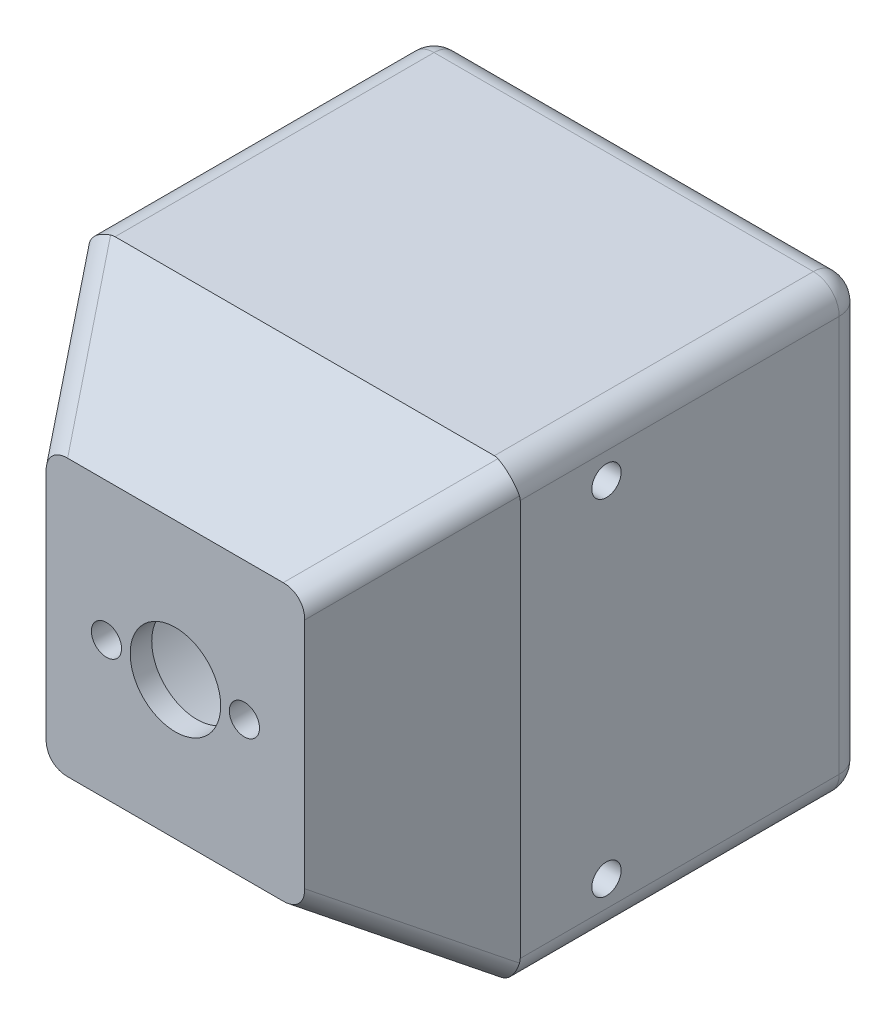
ISO-10303-21;
HEADER;
FILE_DESCRIPTION(('STEP AP214'),'2;1');
FILE_NAME('part.step','',(''),(''),'','','');
FILE_SCHEMA(('AUTOMOTIVE_DESIGN { 1 0 10303 214 1 1 1 1 }'));
ENDSEC;
DATA;
#1=APPLICATION_CONTEXT('core data for automotive mechanical design processes');
#2=APPLICATION_PROTOCOL_DEFINITION('international standard','automotive_design',2000,#1);
#3=PRODUCT_CONTEXT('',#1,'mechanical');
#4=PRODUCT('Part','Part','',(#3));
#5=PRODUCT_RELATED_PRODUCT_CATEGORY('part','',(#4));
#6=PRODUCT_DEFINITION_FORMATION('','',#4);
#7=PRODUCT_DEFINITION_CONTEXT('part definition',#1,'design');
#8=PRODUCT_DEFINITION('design','',#6,#7);
#9=PRODUCT_DEFINITION_SHAPE('','',#8);
#10=(LENGTH_UNIT() NAMED_UNIT(*) SI_UNIT(.MILLI.,.METRE.));
#11=(NAMED_UNIT(*) PLANE_ANGLE_UNIT() SI_UNIT($,.RADIAN.));
#12=(NAMED_UNIT(*) SI_UNIT($,.STERADIAN.) SOLID_ANGLE_UNIT());
#13=UNCERTAINTY_MEASURE_WITH_UNIT(LENGTH_MEASURE(1.E-05),#10,'distance_accuracy_value','');
#14=(GEOMETRIC_REPRESENTATION_CONTEXT(3) GLOBAL_UNCERTAINTY_ASSIGNED_CONTEXT((#13)) GLOBAL_UNIT_ASSIGNED_CONTEXT((#10,
#11,#12)) REPRESENTATION_CONTEXT('',''));
#15=CARTESIAN_POINT('',(0.,0.,0.));
#16=DIRECTION('',(0.,0.,1.));
#17=DIRECTION('',(1.,0.,0.));
#18=AXIS2_PLACEMENT_3D('',#15,#16,#17);
#19=CARTESIAN_POINT('',(25.,26.,82.5));
#20=DIRECTION('',(-1.,0.,0.));
#21=DIRECTION('',(0.,-1.,0.));
#22=AXIS2_PLACEMENT_3D('',#19,#20,#21);
#23=PLANE('',#22);
#24=CARTESIAN_POINT('',(25.,20.,57.5));
#25=DIRECTION('',(1.,0.,0.));
#26=DIRECTION('',(0.,1.,0.));
#27=AXIS2_PLACEMENT_3D('',#24,#25,#26);
#28=CIRCLE('',#27,1.7);
#29=CARTESIAN_POINT('',(25.,21.7,57.5));
#30=VERTEX_POINT('',#29);
#31=EDGE_CURVE('E729',#30,#30,#28,.T.);
#32=ORIENTED_EDGE('',*,*,#31,.F.);
#33=EDGE_LOOP('',(#32));
#34=FACE_BOUND('',#33,.T.);
#35=CARTESIAN_POINT('',(25.,-20.,57.5));
#36=DIRECTION('',(1.,0.,0.));
#37=DIRECTION('',(0.,-1.,0.));
#38=AXIS2_PLACEMENT_3D('',#35,#36,#37);
#39=CIRCLE('',#38,1.7);
#40=CARTESIAN_POINT('',(25.,-21.7,57.5));
#41=VERTEX_POINT('',#40);
#42=EDGE_CURVE('E732',#41,#41,#39,.T.);
#43=ORIENTED_EDGE('',*,*,#42,.F.);
#44=EDGE_LOOP('',(#43));
#45=FACE_BOUND('',#44,.T.);
#46=DIRECTION('',(0.,-1.,0.));
#47=VECTOR('',#46,1.);
#48=CARTESIAN_POINT('',(25.,26.,67.5));
#49=LINE('',#48,#47);
#50=CARTESIAN_POINT('',(25.,23.,67.5));
#51=VERTEX_POINT('',#50);
#52=CARTESIAN_POINT('',(25.,-23.,67.5));
#53=VERTEX_POINT('',#52);
#54=EDGE_CURVE('E724',#51,#53,#49,.T.);
#55=ORIENTED_EDGE('',*,*,#54,.T.);
#56=DIRECTION('',(0.,0.,-1.));
#57=VECTOR('',#56,1.);
#58=CARTESIAN_POINT('',(25.,-23.,82.5));
#59=LINE('',#58,#57);
#60=CARTESIAN_POINT('',(25.,-23.,30.5));
#61=VERTEX_POINT('',#60);
#62=EDGE_CURVE('E626',#53,#61,#59,.T.);
#63=ORIENTED_EDGE('',*,*,#62,.T.);
#64=DIRECTION('',(0.,-1.,0.));
#65=VECTOR('',#64,1.);
#66=CARTESIAN_POINT('',(25.,26.,30.5));
#67=LINE('',#66,#65);
#68=CARTESIAN_POINT('',(25.,23.,30.5));
#69=VERTEX_POINT('',#68);
#70=EDGE_CURVE('E624',#61,#69,#67,.F.);
#71=ORIENTED_EDGE('',*,*,#70,.T.);
#72=DIRECTION('',(0.,0.,-1.));
#73=VECTOR('',#72,1.);
#74=CARTESIAN_POINT('',(25.,23.,82.5));
#75=LINE('',#74,#73);
#76=EDGE_CURVE('E622',#69,#51,#75,.F.);
#77=ORIENTED_EDGE('',*,*,#76,.T.);
#78=EDGE_LOOP('',(#55,#63,#71,#77));
#79=FACE_BOUND('',#78,.T.);
#80=ADVANCED_FACE('F436',(#34,#45,#79),#23,.F.);
#81=CARTESIAN_POINT('',(-25.,26.,82.5));
#82=DIRECTION('',(0.,-1.,0.));
#83=DIRECTION('',(0.,0.,-1.));
#84=AXIS2_PLACEMENT_3D('',#81,#82,#83);
#85=PLANE('',#84);
#86=DIRECTION('',(1.,0.,0.));
#87=VECTOR('',#86,1.);
#88=CARTESIAN_POINT('',(-25.,26.,30.5));
#89=LINE('',#88,#87);
#90=CARTESIAN_POINT('',(22.,26.,30.5));
#91=VERTEX_POINT('',#90);
#92=CARTESIAN_POINT('',(-22.,26.,30.5));
#93=VERTEX_POINT('',#92);
#94=EDGE_CURVE('E569',#91,#93,#89,.F.);
#95=ORIENTED_EDGE('',*,*,#94,.T.);
#96=DIRECTION('',(0.,0.,-1.));
#97=VECTOR('',#96,1.);
#98=CARTESIAN_POINT('',(-22.,26.,82.5));
#99=LINE('',#98,#97);
#100=CARTESIAN_POINT('',(-22.,26.,67.5));
#101=VERTEX_POINT('',#100);
#102=EDGE_CURVE('E608',#93,#101,#99,.F.);
#103=ORIENTED_EDGE('',*,*,#102,.T.);
#104=DIRECTION('',(1.,0.,0.));
#105=VECTOR('',#104,1.);
#106=CARTESIAN_POINT('',(-25.,26.,67.5));
#107=LINE('',#106,#105);
#108=CARTESIAN_POINT('',(22.,26.,67.5));
#109=VERTEX_POINT('',#108);
#110=EDGE_CURVE('E712',#101,#109,#107,.T.);
#111=ORIENTED_EDGE('',*,*,#110,.T.);
#112=DIRECTION('',(0.,0.,-1.));
#113=VECTOR('',#112,1.);
#114=CARTESIAN_POINT('',(22.,26.,82.5));
#115=LINE('',#114,#113);
#116=EDGE_CURVE('E601',#109,#91,#115,.T.);
#117=ORIENTED_EDGE('',*,*,#116,.T.);
#118=EDGE_LOOP('',(#95,#103,#111,#117));
#119=FACE_BOUND('',#118,.T.);
#120=ADVANCED_FACE('F781',(#119),#85,.F.);
#121=CARTESIAN_POINT('',(-25.,26.,82.5));
#122=DIRECTION('',(1.,0.,0.));
#123=DIRECTION('',(0.,1.,0.));
#124=AXIS2_PLACEMENT_3D('',#121,#122,#123);
#125=PLANE('',#124);
#126=CARTESIAN_POINT('',(-25.,20.,57.5));
#127=DIRECTION('',(1.,0.,0.));
#128=DIRECTION('',(0.,1.,0.));
#129=AXIS2_PLACEMENT_3D('',#126,#127,#128);
#130=CIRCLE('',#129,1.7);
#131=CARTESIAN_POINT('',(-25.,21.7,57.5));
#132=VERTEX_POINT('',#131);
#133=EDGE_CURVE('E725',#132,#132,#130,.T.);
#134=ORIENTED_EDGE('',*,*,#133,.T.);
#135=EDGE_LOOP('',(#134));
#136=FACE_BOUND('',#135,.T.);
#137=CARTESIAN_POINT('',(-25.,-20.,57.5));
#138=DIRECTION('',(1.,0.,0.));
#139=DIRECTION('',(0.,-1.,0.));
#140=AXIS2_PLACEMENT_3D('',#137,#138,#139);
#141=CIRCLE('',#140,1.7);
#142=CARTESIAN_POINT('',(-25.,-21.7,57.5));
#143=VERTEX_POINT('',#142);
#144=EDGE_CURVE('E715',#143,#143,#141,.T.);
#145=ORIENTED_EDGE('',*,*,#144,.T.);
#146=EDGE_LOOP('',(#145));
#147=FACE_BOUND('',#146,.T.);
#148=DIRECTION('',(0.,-1.,0.));
#149=VECTOR('',#148,1.);
#150=CARTESIAN_POINT('',(-25.,26.,30.5));
#151=LINE('',#150,#149);
#152=CARTESIAN_POINT('',(-25.,23.,30.5));
#153=VERTEX_POINT('',#152);
#154=CARTESIAN_POINT('',(-25.,-23.,30.5));
#155=VERTEX_POINT('',#154);
#156=EDGE_CURVE('E612',#153,#155,#151,.T.);
#157=ORIENTED_EDGE('',*,*,#156,.T.);
#158=DIRECTION('',(0.,0.,-1.));
#159=VECTOR('',#158,1.);
#160=CARTESIAN_POINT('',(-25.,-23.,82.5));
#161=LINE('',#160,#159);
#162=CARTESIAN_POINT('',(-25.,-23.,67.5));
#163=VERTEX_POINT('',#162);
#164=EDGE_CURVE('E614',#155,#163,#161,.F.);
#165=ORIENTED_EDGE('',*,*,#164,.T.);
#166=DIRECTION('',(0.,-1.,0.));
#167=VECTOR('',#166,1.);
#168=CARTESIAN_POINT('',(-25.,26.,67.5));
#169=LINE('',#168,#167);
#170=CARTESIAN_POINT('',(-25.,23.,67.5));
#171=VERTEX_POINT('',#170);
#172=EDGE_CURVE('E698',#171,#163,#169,.T.);
#173=ORIENTED_EDGE('',*,*,#172,.F.);
#174=DIRECTION('',(0.,0.,-1.));
#175=VECTOR('',#174,1.);
#176=CARTESIAN_POINT('',(-25.,23.,82.5));
#177=LINE('',#176,#175);
#178=EDGE_CURVE('E610',#171,#153,#177,.T.);
#179=ORIENTED_EDGE('',*,*,#178,.T.);
#180=EDGE_LOOP('',(#157,#165,#173,#179));
#181=FACE_BOUND('',#180,.T.);
#182=ADVANCED_FACE('F827',(#136,#147,#181),#125,.F.);
#183=CARTESIAN_POINT('',(-25.,-26.,82.5));
#184=DIRECTION('',(0.,1.,0.));
#185=DIRECTION('',(0.,0.,1.));
#186=AXIS2_PLACEMENT_3D('',#183,#184,#185);
#187=PLANE('',#186);
#188=DIRECTION('',(1.,0.,0.));
#189=VECTOR('',#188,1.);
#190=CARTESIAN_POINT('',(-25.,-26.,30.5));
#191=LINE('',#190,#189);
#192=CARTESIAN_POINT('',(-22.,-26.,30.5));
#193=VERTEX_POINT('',#192);
#194=CARTESIAN_POINT('',(22.,-26.,30.5));
#195=VERTEX_POINT('',#194);
#196=EDGE_CURVE('E618',#193,#195,#191,.T.);
#197=ORIENTED_EDGE('',*,*,#196,.T.);
#198=DIRECTION('',(0.,0.,-1.));
#199=VECTOR('',#198,1.);
#200=CARTESIAN_POINT('',(22.,-26.,82.5));
#201=LINE('',#200,#199);
#202=CARTESIAN_POINT('',(22.,-26.,67.5));
#203=VERTEX_POINT('',#202);
#204=EDGE_CURVE('E620',#195,#203,#201,.F.);
#205=ORIENTED_EDGE('',*,*,#204,.T.);
#206=DIRECTION('',(1.,0.,0.));
#207=VECTOR('',#206,1.);
#208=CARTESIAN_POINT('',(-25.,-26.,67.5));
#209=LINE('',#208,#207);
#210=CARTESIAN_POINT('',(-22.,-26.,67.5));
#211=VERTEX_POINT('',#210);
#212=EDGE_CURVE('E719',#211,#203,#209,.T.);
#213=ORIENTED_EDGE('',*,*,#212,.F.);
#214=DIRECTION('',(0.,0.,-1.));
#215=VECTOR('',#214,1.);
#216=CARTESIAN_POINT('',(-22.,-26.,82.5));
#217=LINE('',#216,#215);
#218=EDGE_CURVE('E616',#211,#193,#217,.T.);
#219=ORIENTED_EDGE('',*,*,#218,.T.);
#220=EDGE_LOOP('',(#197,#205,#213,#219));
#221=FACE_BOUND('',#220,.T.);
#222=ADVANCED_FACE('F1063',(#221),#187,.F.);
#223=CARTESIAN_POINT('',(0.,0.,82.5));
#224=DIRECTION('',(0.,0.,1.));
#225=DIRECTION('',(1.,0.,0.));
#226=AXIS2_PLACEMENT_3D('',#223,#224,#225);
#227=PLANE('',#226);
#228=DIRECTION('',(0.,-1.,0.));
#229=VECTOR('',#228,1.);
#230=CARTESIAN_POINT('',(15.,26.,82.5));
#231=LINE('',#230,#229);
#232=CARTESIAN_POINT('',(15.,13.5038491169865,82.5));
#233=VERTEX_POINT('',#232);
#234=CARTESIAN_POINT('',(15.,-13.5038491169865,82.5));
#235=VERTEX_POINT('',#234);
#236=EDGE_CURVE('E708',#233,#235,#231,.T.);
#237=ORIENTED_EDGE('',*,*,#236,.F.);
#238=CARTESIAN_POINT('',(11.394448724536,12.394448724536,82.5));
#239=DIRECTION('',(0.,0.,1.));
#240=DIRECTION('',(0.707106781186547,0.707106781186548,0.));
#241=AXIS2_PLACEMENT_3D('',#238,#239,#240);
#242=ELLIPSE('',#241,4.12310562561766,3.);
#243=CARTESIAN_POINT('',(12.5038491169865,16.,82.5));
#244=VERTEX_POINT('',#243);
#245=EDGE_CURVE('E650',#233,#244,#242,.T.);
#246=ORIENTED_EDGE('',*,*,#245,.T.);
#247=DIRECTION('',(1.,0.,0.));
#248=VECTOR('',#247,1.);
#249=CARTESIAN_POINT('',(-25.,16.,82.5));
#250=LINE('',#249,#248);
#251=CARTESIAN_POINT('',(-12.5038491169865,16.,82.5));
#252=VERTEX_POINT('',#251);
#253=EDGE_CURVE('E716',#252,#244,#250,.T.);
#254=ORIENTED_EDGE('',*,*,#253,.F.);
#255=CARTESIAN_POINT('',(-11.394448724536,12.394448724536,82.5));
#256=DIRECTION('',(0.,0.,1.));
#257=DIRECTION('',(0.707106781186548,-0.707106781186548,0.));
#258=AXIS2_PLACEMENT_3D('',#255,#256,#257);
#259=ELLIPSE('',#258,4.12310562561766,3.);
#260=CARTESIAN_POINT('',(-15.,13.5038491169865,82.5));
#261=VERTEX_POINT('',#260);
#262=EDGE_CURVE('E648',#252,#261,#259,.T.);
#263=ORIENTED_EDGE('',*,*,#262,.T.);
#264=DIRECTION('',(0.,-1.,0.));
#265=VECTOR('',#264,1.);
#266=CARTESIAN_POINT('',(-15.,26.,82.5));
#267=LINE('',#266,#265);
#268=CARTESIAN_POINT('',(-15.,-13.5038491169865,82.5));
#269=VERTEX_POINT('',#268);
#270=EDGE_CURVE('E703',#261,#269,#267,.T.);
#271=ORIENTED_EDGE('',*,*,#270,.T.);
#272=CARTESIAN_POINT('',(-11.394448724536,-12.394448724536,82.5));
#273=DIRECTION('',(0.,0.,1.));
#274=DIRECTION('',(-0.707106781186547,-0.707106781186548,0.));
#275=AXIS2_PLACEMENT_3D('',#272,#273,#274);
#276=ELLIPSE('',#275,4.12310562561766,3.);
#277=CARTESIAN_POINT('',(-12.5038491169865,-16.,82.5));
#278=VERTEX_POINT('',#277);
#279=EDGE_CURVE('E646',#269,#278,#276,.T.);
#280=ORIENTED_EDGE('',*,*,#279,.T.);
#281=DIRECTION('',(1.,0.,0.));
#282=VECTOR('',#281,1.);
#283=CARTESIAN_POINT('',(-25.,-16.,82.5));
#284=LINE('',#283,#282);
#285=CARTESIAN_POINT('',(12.5038491169865,-16.,82.5));
#286=VERTEX_POINT('',#285);
#287=EDGE_CURVE('E721',#278,#286,#284,.T.);
#288=ORIENTED_EDGE('',*,*,#287,.T.);
#289=CARTESIAN_POINT('',(11.394448724536,-12.394448724536,82.5));
#290=DIRECTION('',(0.,0.,1.));
#291=DIRECTION('',(-0.707106781186548,0.707106781186548,0.));
#292=AXIS2_PLACEMENT_3D('',#289,#290,#291);
#293=ELLIPSE('',#292,4.12310562561766,3.);
#294=EDGE_CURVE('E644',#286,#235,#293,.T.);
#295=ORIENTED_EDGE('',*,*,#294,.T.);
#296=EDGE_LOOP('',(#237,#246,#254,#263,#271,#280,#288,#295));
#297=FACE_BOUND('',#296,.T.);
#298=CARTESIAN_POINT('',(8.,0.,82.5));
#299=DIRECTION('',(0.,0.,1.));
#300=DIRECTION('',(-1.,0.,0.));
#301=AXIS2_PLACEMENT_3D('',#298,#299,#300);
#302=CIRCLE('',#301,1.75);
#303=CARTESIAN_POINT('',(6.25,0.,82.5));
#304=VERTEX_POINT('',#303);
#305=EDGE_CURVE('E728',#304,#304,#302,.T.);
#306=ORIENTED_EDGE('',*,*,#305,.F.);
#307=EDGE_LOOP('',(#306));
#308=FACE_BOUND('',#307,.T.);
#309=CARTESIAN_POINT('',(-8.,0.,82.5));
#310=DIRECTION('',(0.,0.,1.));
#311=DIRECTION('',(1.,0.,0.));
#312=AXIS2_PLACEMENT_3D('',#309,#310,#311);
#313=CIRCLE('',#312,1.75);
#314=CARTESIAN_POINT('',(-6.25,0.,82.5));
#315=VERTEX_POINT('',#314);
#316=EDGE_CURVE('E737',#315,#315,#313,.T.);
#317=ORIENTED_EDGE('',*,*,#316,.F.);
#318=EDGE_LOOP('',(#317));
#319=FACE_BOUND('',#318,.T.);
#320=CARTESIAN_POINT('',(0.,0.,82.5));
#321=DIRECTION('',(0.,0.,1.));
#322=DIRECTION('',(1.,0.,0.));
#323=AXIS2_PLACEMENT_3D('',#320,#321,#322);
#324=CIRCLE('',#323,5.25);
#325=CARTESIAN_POINT('',(5.25,0.,82.5));
#326=VERTEX_POINT('',#325);
#327=EDGE_CURVE('E740',#326,#326,#324,.T.);
#328=ORIENTED_EDGE('',*,*,#327,.F.);
#329=EDGE_LOOP('',(#328));
#330=FACE_BOUND('',#329,.T.);
#331=ADVANCED_FACE('F1054',(#297,#308,#319,#330),#227,.T.);
#332=CARTESIAN_POINT('',(0.,0.,80.));
#333=DIRECTION('',(0.,0.,-1.));
#334=DIRECTION('',(-1.,0.,0.));
#335=AXIS2_PLACEMENT_3D('',#332,#333,#334);
#336=CYLINDRICAL_SURFACE('',#335,15.);
#337=CARTESIAN_POINT('',(0.,0.,30.5));
#338=DIRECTION('',(0.,0.,1.));
#339=DIRECTION('',(0.,-1.,0.));
#340=AXIS2_PLACEMENT_3D('',#337,#338,#339);
#341=CIRCLE('',#340,15.);
#342=CARTESIAN_POINT('',(0.,-15.,30.5));
#343=VERTEX_POINT('',#342);
#344=EDGE_CURVE('E592',#343,#343,#341,.F.);
#345=ORIENTED_EDGE('',*,*,#344,.T.);
#346=EDGE_LOOP('',(#345));
#347=FACE_BOUND('',#346,.T.);
#348=CARTESIAN_POINT('',(0.,0.,80.));
#349=DIRECTION('',(0.,0.,-1.));
#350=DIRECTION('',(-1.,0.,0.));
#351=AXIS2_PLACEMENT_3D('',#348,#349,#350);
#352=CIRCLE('',#351,15.);
#353=CARTESIAN_POINT('',(-15.,0.,80.));
#354=VERTEX_POINT('',#353);
#355=EDGE_CURVE('E746',#354,#354,#352,.T.);
#356=ORIENTED_EDGE('',*,*,#355,.F.);
#357=EDGE_LOOP('',(#356));
#358=FACE_BOUND('',#357,.T.);
#359=ADVANCED_FACE('F1045',(#347,#358),#336,.F.);
#360=CARTESIAN_POINT('',(0.,0.,80.));
#361=DIRECTION('',(0.,0.,-1.));
#362=DIRECTION('',(-1.,0.,0.));
#363=AXIS2_PLACEMENT_3D('',#360,#361,#362);
#364=PLANE('',#363);
#365=CARTESIAN_POINT('',(8.,0.,80.));
#366=DIRECTION('',(0.,0.,-1.));
#367=DIRECTION('',(-1.,0.,0.));
#368=AXIS2_PLACEMENT_3D('',#365,#366,#367);
#369=CIRCLE('',#368,1.75);
#370=CARTESIAN_POINT('',(6.25,0.,80.));
#371=VERTEX_POINT('',#370);
#372=EDGE_CURVE('E749',#371,#371,#369,.T.);
#373=ORIENTED_EDGE('',*,*,#372,.F.);
#374=EDGE_LOOP('',(#373));
#375=FACE_BOUND('',#374,.T.);
#376=CARTESIAN_POINT('',(-8.,0.,80.));
#377=DIRECTION('',(0.,0.,-1.));
#378=DIRECTION('',(-1.,0.,0.));
#379=AXIS2_PLACEMENT_3D('',#376,#377,#378);
#380=CIRCLE('',#379,1.75);
#381=CARTESIAN_POINT('',(-9.75,0.,80.));
#382=VERTEX_POINT('',#381);
#383=EDGE_CURVE('E752',#382,#382,#380,.T.);
#384=ORIENTED_EDGE('',*,*,#383,.F.);
#385=EDGE_LOOP('',(#384));
#386=FACE_BOUND('',#385,.T.);
#387=CARTESIAN_POINT('',(0.,0.,80.));
#388=DIRECTION('',(0.,0.,-1.));
#389=DIRECTION('',(-1.,0.,0.));
#390=AXIS2_PLACEMENT_3D('',#387,#388,#389);
#391=CIRCLE('',#390,5.25);
#392=CARTESIAN_POINT('',(-5.25,0.,80.));
#393=VERTEX_POINT('',#392);
#394=EDGE_CURVE('E745',#393,#393,#391,.T.);
#395=ORIENTED_EDGE('',*,*,#394,.F.);
#396=EDGE_LOOP('',(#395));
#397=FACE_BOUND('',#396,.T.);
#398=ORIENTED_EDGE('',*,*,#355,.T.);
#399=EDGE_LOOP('',(#398));
#400=FACE_BOUND('',#399,.T.);
#401=ADVANCED_FACE('F1036',(#375,#386,#397,#400),#364,.T.);
#402=CARTESIAN_POINT('',(0.,0.,0.));
#403=DIRECTION('',(0.,0.,1.));
#404=DIRECTION('',(1.,0.,0.));
#405=AXIS2_PLACEMENT_3D('',#402,#403,#404);
#406=CYLINDRICAL_SURFACE('',#405,5.25);
#407=ORIENTED_EDGE('',*,*,#394,.T.);
#408=EDGE_LOOP('',(#407));
#409=FACE_BOUND('',#408,.T.);
#410=ORIENTED_EDGE('',*,*,#327,.T.);
#411=EDGE_LOOP('',(#410));
#412=FACE_BOUND('',#411,.T.);
#413=ADVANCED_FACE('F1027',(#409,#412),#406,.F.);
#414=CARTESIAN_POINT('',(-8.,0.,0.));
#415=DIRECTION('',(0.,0.,1.));
#416=DIRECTION('',(1.,0.,0.));
#417=AXIS2_PLACEMENT_3D('',#414,#415,#416);
#418=CYLINDRICAL_SURFACE('',#417,1.75);
#419=ORIENTED_EDGE('',*,*,#383,.T.);
#420=EDGE_LOOP('',(#419));
#421=FACE_BOUND('',#420,.T.);
#422=ORIENTED_EDGE('',*,*,#316,.T.);
#423=EDGE_LOOP('',(#422));
#424=FACE_BOUND('',#423,.T.);
#425=ADVANCED_FACE('F1018',(#421,#424),#418,.F.);
#426=CARTESIAN_POINT('',(8.,0.,0.));
#427=DIRECTION('',(0.,0.,1.));
#428=DIRECTION('',(1.,0.,0.));
#429=AXIS2_PLACEMENT_3D('',#426,#427,#428);
#430=CYLINDRICAL_SURFACE('',#429,1.75);
#431=ORIENTED_EDGE('',*,*,#372,.T.);
#432=EDGE_LOOP('',(#431));
#433=FACE_BOUND('',#432,.T.);
#434=ORIENTED_EDGE('',*,*,#305,.T.);
#435=EDGE_LOOP('',(#434));
#436=FACE_BOUND('',#435,.T.);
#437=ADVANCED_FACE('F1009',(#433,#436),#430,.F.);
#438=CARTESIAN_POINT('',(-25.,-20.,57.5));
#439=DIRECTION('',(1.,0.,0.));
#440=DIRECTION('',(0.,1.,0.));
#441=AXIS2_PLACEMENT_3D('',#438,#439,#440);
#442=CYLINDRICAL_SURFACE('',#441,1.7);
#443=ORIENTED_EDGE('',*,*,#144,.F.);
#444=EDGE_LOOP('',(#443));
#445=FACE_BOUND('',#444,.T.);
#446=ORIENTED_EDGE('',*,*,#42,.T.);
#447=EDGE_LOOP('',(#446));
#448=FACE_BOUND('',#447,.T.);
#449=ADVANCED_FACE('F1000',(#445,#448),#442,.F.);
#450=CARTESIAN_POINT('',(-25.,20.,57.5));
#451=DIRECTION('',(1.,0.,0.));
#452=DIRECTION('',(0.,1.,0.));
#453=AXIS2_PLACEMENT_3D('',#450,#451,#452);
#454=CYLINDRICAL_SURFACE('',#453,1.7);
#455=ORIENTED_EDGE('',*,*,#133,.F.);
#456=EDGE_LOOP('',(#455));
#457=FACE_BOUND('',#456,.T.);
#458=ORIENTED_EDGE('',*,*,#31,.T.);
#459=EDGE_LOOP('',(#458));
#460=FACE_BOUND('',#459,.T.);
#461=ADVANCED_FACE('F992',(#457,#460),#454,.F.);
#462=CARTESIAN_POINT('',(-25.,-26.,27.5));
#463=DIRECTION('',(0.,0.,1.));
#464=DIRECTION('',(0.,-1.,0.));
#465=AXIS2_PLACEMENT_3D('',#462,#463,#464);
#466=PLANE('',#465);
#467=CARTESIAN_POINT('',(0.,0.,27.5));
#468=DIRECTION('',(0.,0.,1.));
#469=DIRECTION('',(0.,-1.,0.));
#470=AXIS2_PLACEMENT_3D('',#467,#468,#469);
#471=CIRCLE('',#470,18.);
#472=CARTESIAN_POINT('',(0.,-18.,27.5));
#473=VERTEX_POINT('',#472);
#474=EDGE_CURVE('E598',#473,#473,#471,.T.);
#475=ORIENTED_EDGE('',*,*,#474,.T.);
#476=EDGE_LOOP('',(#475));
#477=FACE_BOUND('',#476,.T.);
#478=DIRECTION('',(0.,-1.,0.));
#479=VECTOR('',#478,1.);
#480=CARTESIAN_POINT('',(-22.,-26.,27.5));
#481=LINE('',#480,#479);
#482=CARTESIAN_POINT('',(-22.,-23.,27.5));
#483=VERTEX_POINT('',#482);
#484=CARTESIAN_POINT('',(-22.,23.,27.5));
#485=VERTEX_POINT('',#484);
#486=EDGE_CURVE('E596',#483,#485,#481,.F.);
#487=ORIENTED_EDGE('',*,*,#486,.T.);
#488=DIRECTION('',(1.,0.,0.));
#489=VECTOR('',#488,1.);
#490=CARTESIAN_POINT('',(-25.,23.,27.5));
#491=LINE('',#490,#489);
#492=CARTESIAN_POINT('',(22.,23.,27.5));
#493=VERTEX_POINT('',#492);
#494=EDGE_CURVE('E567',#485,#493,#491,.T.);
#495=ORIENTED_EDGE('',*,*,#494,.T.);
#496=DIRECTION('',(0.,-1.,0.));
#497=VECTOR('',#496,1.);
#498=CARTESIAN_POINT('',(22.,-26.,27.5));
#499=LINE('',#498,#497);
#500=CARTESIAN_POINT('',(22.,-23.,27.5));
#501=VERTEX_POINT('',#500);
#502=EDGE_CURVE('E585',#493,#501,#499,.T.);
#503=ORIENTED_EDGE('',*,*,#502,.T.);
#504=DIRECTION('',(1.,0.,0.));
#505=VECTOR('',#504,1.);
#506=CARTESIAN_POINT('',(-25.,-23.,27.5));
#507=LINE('',#506,#505);
#508=EDGE_CURVE('E591',#501,#483,#507,.F.);
#509=ORIENTED_EDGE('',*,*,#508,.T.);
#510=EDGE_LOOP('',(#487,#495,#503,#509));
#511=FACE_BOUND('',#510,.T.);
#512=ADVANCED_FACE('F594',(#477,#511),#466,.F.);
#513=CARTESIAN_POINT('',(-25.,-16.,82.5));
#514=DIRECTION('',(0.,0.832050294337843,-0.554700196225229));
#515=DIRECTION('',(0.,0.554700196225229,0.832050294337844));
#516=AXIS2_PLACEMENT_3D('',#513,#514,#515);
#517=PLANE('',#516);
#518=CARTESIAN_POINT('',(22.,-23.,72.));
#519=DIRECTION('',(0.,0.832050294337843,-0.554700196225229));
#520=DIRECTION('',(0.,-0.554700196225229,-0.832050294337844));
#521=AXIS2_PLACEMENT_3D('',#518,#519,#520);
#522=ELLIPSE('',#521,5.40832691319598,3.);
#523=CARTESIAN_POINT('',(22.4672401831838,-25.9633910661974,67.554913400704));
#524=VERTEX_POINT('',#523);
#525=EDGE_CURVE('E445',#203,#524,#522,.F.);
#526=ORIENTED_EDGE('',*,*,#525,.T.);
#527=DIRECTION('',(-0.485071250072666,0.485071250072666,0.727606875108999));
#528=VECTOR('',#527,1.);
#529=CARTESIAN_POINT('',(3.67941403063671,-7.17556491365025,95.7366526295246));
#530=LINE('',#529,#528);
#531=EDGE_CURVE('E12',#524,#286,#530,.T.);
#532=ORIENTED_EDGE('',*,*,#531,.T.);
#533=ORIENTED_EDGE('',*,*,#287,.F.);
#534=DIRECTION('',(-0.485071250072666,-0.485071250072666,-0.727606875108999));
#535=VECTOR('',#534,1.);
#536=CARTESIAN_POINT('',(-15.4441199129897,-18.9402707960032,78.0895938059952));
#537=LINE('',#536,#535);
#538=CARTESIAN_POINT('',(-22.4672401831838,-25.9633910661974,67.554913400704));
#539=VERTEX_POINT('',#538);
#540=EDGE_CURVE('E458',#278,#539,#537,.T.);
#541=ORIENTED_EDGE('',*,*,#540,.T.);
#542=CARTESIAN_POINT('',(-22.,-23.,72.));
#543=DIRECTION('',(0.,0.832050294337843,-0.554700196225229));
#544=DIRECTION('',(0.,-0.554700196225229,-0.832050294337844));
#545=AXIS2_PLACEMENT_3D('',#542,#543,#544);
#546=ELLIPSE('',#545,5.40832691319598,3.);
#547=EDGE_CURVE('E660',#539,#211,#546,.F.);
#548=ORIENTED_EDGE('',*,*,#547,.T.);
#549=ORIENTED_EDGE('',*,*,#212,.T.);
#550=EDGE_LOOP('',(#526,#532,#533,#541,#548,#549));
#551=FACE_BOUND('',#550,.T.);
#552=ADVANCED_FACE('F976',(#551),#517,.F.);
#553=CARTESIAN_POINT('',(-25.,16.,82.5));
#554=DIRECTION('',(0.,-0.832050294337843,-0.554700196225229));
#555=DIRECTION('',(0.,0.554700196225229,-0.832050294337844));
#556=AXIS2_PLACEMENT_3D('',#553,#554,#555);
#557=PLANE('',#556);
#558=CARTESIAN_POINT('',(-22.,23.,72.));
#559=DIRECTION('',(0.,-0.832050294337843,-0.554700196225229));
#560=DIRECTION('',(0.,0.554700196225229,-0.832050294337844));
#561=AXIS2_PLACEMENT_3D('',#558,#559,#560);
#562=ELLIPSE('',#561,5.40832691319598,3.);
#563=CARTESIAN_POINT('',(-22.4672401831839,25.9633910661974,67.554913400704));
#564=VERTEX_POINT('',#563);
#565=EDGE_CURVE('E632',#101,#564,#562,.F.);
#566=ORIENTED_EDGE('',*,*,#565,.T.);
#567=DIRECTION('',(0.485071250072666,-0.485071250072666,0.727606875108999));
#568=VECTOR('',#567,1.);
#569=CARTESIAN_POINT('',(-15.4441199129897,18.9402707960032,78.0895938059952));
#570=LINE('',#569,#568);
#571=EDGE_CURVE('E634',#564,#252,#570,.T.);
#572=ORIENTED_EDGE('',*,*,#571,.T.);
#573=ORIENTED_EDGE('',*,*,#253,.T.);
#574=DIRECTION('',(0.485071250072666,0.485071250072666,-0.727606875108999));
#575=VECTOR('',#574,1.);
#576=CARTESIAN_POINT('',(3.67941403063672,7.17556491365022,95.7366526295246));
#577=LINE('',#576,#575);
#578=CARTESIAN_POINT('',(22.4672401831838,25.9633910661974,67.554913400704));
#579=VERTEX_POINT('',#578);
#580=EDGE_CURVE('E630',#244,#579,#577,.T.);
#581=ORIENTED_EDGE('',*,*,#580,.T.);
#582=CARTESIAN_POINT('',(22.,23.,72.));
#583=DIRECTION('',(0.,-0.832050294337843,-0.554700196225229));
#584=DIRECTION('',(0.,0.554700196225229,-0.832050294337844));
#585=AXIS2_PLACEMENT_3D('',#582,#583,#584);
#586=ELLIPSE('',#585,5.40832691319598,3.);
#587=EDGE_CURVE('E628',#579,#109,#586,.F.);
#588=ORIENTED_EDGE('',*,*,#587,.T.);
#589=ORIENTED_EDGE('',*,*,#110,.F.);
#590=EDGE_LOOP('',(#566,#572,#573,#581,#588,#589));
#591=FACE_BOUND('',#590,.T.);
#592=ADVANCED_FACE('F968',(#591),#557,.F.);
#593=CARTESIAN_POINT('',(-15.,26.,82.5));
#594=DIRECTION('',(0.832050294337844,0.,-0.554700196225229));
#595=DIRECTION('',(-0.554700196225229,0.,-0.832050294337844));
#596=AXIS2_PLACEMENT_3D('',#593,#594,#595);
#597=PLANE('',#596);
#598=CARTESIAN_POINT('',(-22.,-23.,72.0000000000001));
#599=DIRECTION('',(0.832050294337844,0.,-0.554700196225229));
#600=DIRECTION('',(-0.554700196225229,0.,-0.832050294337844));
#601=AXIS2_PLACEMENT_3D('',#598,#599,#600);
#602=ELLIPSE('',#601,5.40832691319598,3.);
#603=CARTESIAN_POINT('',(-24.9633910661974,-23.4672401831838,67.554913400704));
#604=VERTEX_POINT('',#603);
#605=EDGE_CURVE('E656',#163,#604,#602,.F.);
#606=ORIENTED_EDGE('',*,*,#605,.T.);
#607=DIRECTION('',(-0.485071250072666,-0.485071250072666,-0.727606875108999));
#608=VECTOR('',#607,1.);
#609=CARTESIAN_POINT('',(-5.70497667835614,-4.2088257953426,96.4425349824658));
#610=LINE('',#609,#608);
#611=EDGE_CURVE('E658',#604,#269,#610,.F.);
#612=ORIENTED_EDGE('',*,*,#611,.T.);
#613=ORIENTED_EDGE('',*,*,#270,.F.);
#614=DIRECTION('',(0.485071250072666,-0.485071250072666,0.727606875108999));
#615=VECTOR('',#614,1.);
#616=CARTESIAN_POINT('',(-17.9402707960032,16.4441199129896,78.0895938059952));
#617=LINE('',#616,#615);
#618=CARTESIAN_POINT('',(-24.9633910661974,23.4672401831838,67.554913400704));
#619=VERTEX_POINT('',#618);
#620=EDGE_CURVE('E654',#261,#619,#617,.F.);
#621=ORIENTED_EDGE('',*,*,#620,.T.);
#622=CARTESIAN_POINT('',(-22.,23.,72.));
#623=DIRECTION('',(0.832050294337844,0.,-0.554700196225229));
#624=DIRECTION('',(-0.554700196225229,0.,-0.832050294337844));
#625=AXIS2_PLACEMENT_3D('',#622,#623,#624);
#626=ELLIPSE('',#625,5.40832691319598,3.);
#627=EDGE_CURVE('E652',#619,#171,#626,.F.);
#628=ORIENTED_EDGE('',*,*,#627,.T.);
#629=ORIENTED_EDGE('',*,*,#172,.T.);
#630=EDGE_LOOP('',(#606,#612,#613,#621,#628,#629));
#631=FACE_BOUND('',#630,.T.);
#632=ADVANCED_FACE('F960',(#631),#597,.F.);
#633=CARTESIAN_POINT('',(15.,26.,82.5));
#634=DIRECTION('',(-0.832050294337844,0.,-0.554700196225229));
#635=DIRECTION('',(-0.554700196225229,0.,0.832050294337844));
#636=AXIS2_PLACEMENT_3D('',#633,#634,#635);
#637=PLANE('',#636);
#638=ORIENTED_EDGE('',*,*,#236,.T.);
#639=DIRECTION('',(-0.485071250072666,0.485071250072666,0.727606875108999));
#640=VECTOR('',#639,1.);
#641=CARTESIAN_POINT('',(5.70497667835613,-4.20882579534261,96.4425349824658));
#642=LINE('',#641,#640);
#643=CARTESIAN_POINT('',(24.9633910661974,-23.4672401831838,67.554913400704));
#644=VERTEX_POINT('',#643);
#645=EDGE_CURVE('E642',#235,#644,#642,.F.);
#646=ORIENTED_EDGE('',*,*,#645,.T.);
#647=CARTESIAN_POINT('',(22.,-23.,72.));
#648=DIRECTION('',(-0.832050294337844,0.,-0.554700196225229));
#649=DIRECTION('',(0.554700196225229,0.,-0.832050294337844));
#650=AXIS2_PLACEMENT_3D('',#647,#648,#649);
#651=ELLIPSE('',#650,5.40832691319598,3.);
#652=EDGE_CURVE('E640',#644,#53,#651,.F.);
#653=ORIENTED_EDGE('',*,*,#652,.T.);
#654=ORIENTED_EDGE('',*,*,#54,.F.);
#655=CARTESIAN_POINT('',(22.,23.,72.));
#656=DIRECTION('',(-0.832050294337844,0.,-0.554700196225229));
#657=DIRECTION('',(0.554700196225229,0.,-0.832050294337844));
#658=AXIS2_PLACEMENT_3D('',#655,#656,#657);
#659=ELLIPSE('',#658,5.40832691319598,3.);
#660=CARTESIAN_POINT('',(24.9633910661974,23.4672401831838,67.554913400704));
#661=VERTEX_POINT('',#660);
#662=EDGE_CURVE('E636',#51,#661,#659,.F.);
#663=ORIENTED_EDGE('',*,*,#662,.T.);
#664=DIRECTION('',(0.485071250072666,0.485071250072666,-0.727606875108999));
#665=VECTOR('',#664,1.);
#666=CARTESIAN_POINT('',(17.9402707960032,16.4441199129896,78.0895938059952));
#667=LINE('',#666,#665);
#668=EDGE_CURVE('E638',#661,#233,#667,.F.);
#669=ORIENTED_EDGE('',*,*,#668,.T.);
#670=EDGE_LOOP('',(#638,#646,#653,#654,#663,#669));
#671=FACE_BOUND('',#670,.T.);
#672=ADVANCED_FACE('F794',(#671),#637,.F.);
#673=CARTESIAN_POINT('',(0.,0.,30.5));
#674=DIRECTION('',(0.,0.,1.));
#675=DIRECTION('',(0.,-1.,0.));
#676=AXIS2_PLACEMENT_3D('',#673,#674,#675);
#677=TOROIDAL_SURFACE('',#676,18.,3.);
#678=ORIENTED_EDGE('',*,*,#474,.F.);
#679=EDGE_LOOP('',(#678));
#680=FACE_BOUND('',#679,.T.);
#681=ORIENTED_EDGE('',*,*,#344,.F.);
#682=EDGE_LOOP('',(#681));
#683=FACE_BOUND('',#682,.T.);
#684=ADVANCED_FACE('F833',(#680,#683),#677,.T.);
#685=CARTESIAN_POINT('',(-15.4441199129897,-16.4441199129897,76.4254932173195));
#686=DIRECTION('',(-0.485071250072666,-0.485071250072666,-0.727606875108999));
#687=DIRECTION('',(0.,0.832050294337844,-0.554700196225229));
#688=AXIS2_PLACEMENT_3D('',#685,#686,#687);
#689=CYLINDRICAL_SURFACE('',#688,3.);
#690=ORIENTED_EDGE('',*,*,#279,.F.);
#691=ORIENTED_EDGE('',*,*,#611,.F.);
#692=CARTESIAN_POINT('',(-22.,-23.,66.5916730868041));
#693=DIRECTION('',(-0.260956473808852,-0.260956473808852,-0.929410263314592));
#694=DIRECTION('',(0.657192299694123,0.657192299694123,-0.369048184449539));
#695=AXIS2_PLACEMENT_3D('',#692,#693,#694);
#696=ELLIPSE('',#695,3.22785331560788,3.);
#697=EDGE_CURVE('E440',#539,#604,#696,.T.);
#698=ORIENTED_EDGE('',*,*,#697,.F.);
#699=ORIENTED_EDGE('',*,*,#540,.F.);
#700=EDGE_LOOP('',(#690,#691,#698,#699));
#701=FACE_BOUND('',#700,.T.);
#702=ADVANCED_FACE('F438',(#701),#689,.T.);
#703=CARTESIAN_POINT('',(3.67941403063671,-4.67941403063672,94.0725520408489));
#704=DIRECTION('',(-0.485071250072666,0.485071250072666,0.727606875108999));
#705=DIRECTION('',(0.832050294337844,0.,0.554700196225229));
#706=AXIS2_PLACEMENT_3D('',#703,#704,#705);
#707=CYLINDRICAL_SURFACE('',#706,3.);
#708=ORIENTED_EDGE('',*,*,#294,.F.);
#709=ORIENTED_EDGE('',*,*,#531,.F.);
#710=CARTESIAN_POINT('',(22.,-23.,66.591673086804));
#711=DIRECTION('',(0.260956473808853,-0.260956473808852,-0.929410263314592));
#712=DIRECTION('',(-0.657192299694123,0.657192299694123,-0.369048184449538));
#713=AXIS2_PLACEMENT_3D('',#710,#711,#712);
#714=ELLIPSE('',#713,3.22785331560788,3.);
#715=EDGE_CURVE('E692',#644,#524,#714,.T.);
#716=ORIENTED_EDGE('',*,*,#715,.F.);
#717=ORIENTED_EDGE('',*,*,#645,.F.);
#718=EDGE_LOOP('',(#708,#709,#716,#717));
#719=FACE_BOUND('',#718,.T.);
#720=ADVANCED_FACE('F803',(#719),#707,.T.);
#721=CARTESIAN_POINT('',(-22.,-23.,82.5));
#722=DIRECTION('',(0.,0.,-1.));
#723=DIRECTION('',(-1.,0.,0.));
#724=AXIS2_PLACEMENT_3D('',#721,#722,#723);
#725=CYLINDRICAL_SURFACE('',#724,3.);
#726=ORIENTED_EDGE('',*,*,#605,.F.);
#727=ORIENTED_EDGE('',*,*,#164,.F.);
#728=CARTESIAN_POINT('',(-22.,-23.,30.5));
#729=DIRECTION('',(0.,0.,-1.));
#730=DIRECTION('',(-1.,0.,0.));
#731=AXIS2_PLACEMENT_3D('',#728,#729,#730);
#732=CIRCLE('',#731,3.);
#733=EDGE_CURVE('E690',#193,#155,#732,.T.);
#734=ORIENTED_EDGE('',*,*,#733,.F.);
#735=ORIENTED_EDGE('',*,*,#218,.F.);
#736=ORIENTED_EDGE('',*,*,#547,.F.);
#737=ORIENTED_EDGE('',*,*,#697,.T.);
#738=EDGE_LOOP('',(#726,#727,#734,#735,#736,#737));
#739=FACE_BOUND('',#738,.T.);
#740=ADVANCED_FACE('F927',(#739),#725,.T.);
#741=CARTESIAN_POINT('',(-25.,-23.,30.5));
#742=DIRECTION('',(1.,0.,0.));
#743=DIRECTION('',(0.,0.,-1.));
#744=AXIS2_PLACEMENT_3D('',#741,#742,#743);
#745=CYLINDRICAL_SURFACE('',#744,3.);
#746=CARTESIAN_POINT('',(22.,-23.,30.5));
#747=DIRECTION('',(1.,0.,0.));
#748=DIRECTION('',(0.,0.,-1.));
#749=AXIS2_PLACEMENT_3D('',#746,#747,#748);
#750=CIRCLE('',#749,3.);
#751=EDGE_CURVE('E684',#195,#501,#750,.T.);
#752=ORIENTED_EDGE('',*,*,#751,.F.);
#753=ORIENTED_EDGE('',*,*,#196,.F.);
#754=CARTESIAN_POINT('',(-22.,-23.,30.5));
#755=DIRECTION('',(-1.,0.,0.));
#756=DIRECTION('',(0.,0.,1.));
#757=AXIS2_PLACEMENT_3D('',#754,#755,#756);
#758=CIRCLE('',#757,3.);
#759=EDGE_CURVE('E687',#483,#193,#758,.T.);
#760=ORIENTED_EDGE('',*,*,#759,.F.);
#761=ORIENTED_EDGE('',*,*,#508,.F.);
#762=EDGE_LOOP('',(#752,#753,#760,#761));
#763=FACE_BOUND('',#762,.T.);
#764=ADVANCED_FACE('F763',(#763),#745,.T.);
#765=CARTESIAN_POINT('',(22.,-23.,82.5));
#766=DIRECTION('',(0.,0.,-1.));
#767=DIRECTION('',(-1.,0.,0.));
#768=AXIS2_PLACEMENT_3D('',#765,#766,#767);
#769=CYLINDRICAL_SURFACE('',#768,3.);
#770=ORIENTED_EDGE('',*,*,#525,.F.);
#771=ORIENTED_EDGE('',*,*,#204,.F.);
#772=CARTESIAN_POINT('',(22.,-23.,30.5));
#773=DIRECTION('',(0.,0.,-1.));
#774=DIRECTION('',(0.,1.,0.));
#775=AXIS2_PLACEMENT_3D('',#772,#773,#774);
#776=CIRCLE('',#775,3.);
#777=EDGE_CURVE('E681',#61,#195,#776,.T.);
#778=ORIENTED_EDGE('',*,*,#777,.F.);
#779=ORIENTED_EDGE('',*,*,#62,.F.);
#780=ORIENTED_EDGE('',*,*,#652,.F.);
#781=ORIENTED_EDGE('',*,*,#715,.T.);
#782=EDGE_LOOP('',(#770,#771,#778,#779,#780,#781));
#783=FACE_BOUND('',#782,.T.);
#784=ADVANCED_FACE('F804',(#783),#769,.T.);
#785=CARTESIAN_POINT('',(-15.4441199129897,16.4441199129896,76.4254932173195));
#786=DIRECTION('',(0.485071250072666,-0.485071250072666,0.727606875108999));
#787=DIRECTION('',(0.832050294337844,0.,-0.554700196225229));
#788=AXIS2_PLACEMENT_3D('',#785,#786,#787);
#789=CYLINDRICAL_SURFACE('',#788,3.);
#790=ORIENTED_EDGE('',*,*,#262,.F.);
#791=ORIENTED_EDGE('',*,*,#571,.F.);
#792=CARTESIAN_POINT('',(-22.,23.,66.591673086804));
#793=DIRECTION('',(-0.260956473808853,0.260956473808852,-0.929410263314592));
#794=DIRECTION('',(0.657192299694123,-0.657192299694123,-0.369048184449538));
#795=AXIS2_PLACEMENT_3D('',#792,#793,#794);
#796=ELLIPSE('',#795,3.22785331560788,3.);
#797=EDGE_CURVE('E678',#619,#564,#796,.T.);
#798=ORIENTED_EDGE('',*,*,#797,.F.);
#799=ORIENTED_EDGE('',*,*,#620,.F.);
#800=EDGE_LOOP('',(#790,#791,#798,#799));
#801=FACE_BOUND('',#800,.T.);
#802=ADVANCED_FACE('F818',(#801),#789,.T.);
#803=CARTESIAN_POINT('',(-22.,-23.,30.5));
#804=DIRECTION('',(0.,-1.,0.));
#805=DIRECTION('',(0.,0.,-1.));
#806=AXIS2_PLACEMENT_3D('',#803,#804,#805);
#807=SPHERICAL_SURFACE('',#806,3.);
#808=ORIENTED_EDGE('',*,*,#759,.T.);
#809=ORIENTED_EDGE('',*,*,#733,.T.);
#810=CARTESIAN_POINT('',(-22.,-23.,30.5));
#811=DIRECTION('',(0.,-1.,0.));
#812=DIRECTION('',(0.,0.,-1.));
#813=AXIS2_PLACEMENT_3D('',#810,#811,#812);
#814=CIRCLE('',#813,3.);
#815=EDGE_CURVE('E675',#483,#155,#814,.F.);
#816=ORIENTED_EDGE('',*,*,#815,.F.);
#817=EDGE_LOOP('',(#808,#809,#816));
#818=FACE_BOUND('',#817,.T.);
#819=ADVANCED_FACE('F766',(#818),#807,.T.);
#820=CARTESIAN_POINT('',(22.,-23.,30.5));
#821=DIRECTION('',(0.,-1.,0.));
#822=DIRECTION('',(0.,0.,-1.));
#823=AXIS2_PLACEMENT_3D('',#820,#821,#822);
#824=SPHERICAL_SURFACE('',#823,3.);
#825=ORIENTED_EDGE('',*,*,#777,.T.);
#826=ORIENTED_EDGE('',*,*,#751,.T.);
#827=CARTESIAN_POINT('',(22.,-23.,30.5));
#828=DIRECTION('',(0.,-1.,0.));
#829=DIRECTION('',(1.,0.,0.));
#830=AXIS2_PLACEMENT_3D('',#827,#828,#829);
#831=CIRCLE('',#830,3.);
#832=EDGE_CURVE('E588',#61,#501,#831,.F.);
#833=ORIENTED_EDGE('',*,*,#832,.F.);
#834=EDGE_LOOP('',(#825,#826,#833));
#835=FACE_BOUND('',#834,.T.);
#836=ADVANCED_FACE('F808',(#835),#824,.T.);
#837=CARTESIAN_POINT('',(3.67941403063671,4.67941403063669,94.072552040849));
#838=DIRECTION('',(0.485071250072666,0.485071250072666,-0.727606875108999));
#839=DIRECTION('',(0.,0.832050294337844,0.554700196225229));
#840=AXIS2_PLACEMENT_3D('',#837,#838,#839);
#841=CYLINDRICAL_SURFACE('',#840,3.);
#842=ORIENTED_EDGE('',*,*,#245,.F.);
#843=ORIENTED_EDGE('',*,*,#668,.F.);
#844=CARTESIAN_POINT('',(22.,23.,66.591673086804));
#845=DIRECTION('',(0.260956473808852,0.260956473808852,-0.929410263314592));
#846=DIRECTION('',(-0.657192299694123,-0.657192299694123,-0.369048184449539));
#847=AXIS2_PLACEMENT_3D('',#844,#845,#846);
#848=ELLIPSE('',#847,3.22785331560788,3.);
#849=EDGE_CURVE('E671',#579,#661,#848,.T.);
#850=ORIENTED_EDGE('',*,*,#849,.F.);
#851=ORIENTED_EDGE('',*,*,#580,.F.);
#852=EDGE_LOOP('',(#842,#843,#850,#851));
#853=FACE_BOUND('',#852,.T.);
#854=ADVANCED_FACE('F810',(#853),#841,.T.);
#855=CARTESIAN_POINT('',(-22.,23.,82.5));
#856=DIRECTION('',(0.,0.,-1.));
#857=DIRECTION('',(-1.,0.,0.));
#858=AXIS2_PLACEMENT_3D('',#855,#856,#857);
#859=CYLINDRICAL_SURFACE('',#858,3.);
#860=ORIENTED_EDGE('',*,*,#565,.F.);
#861=ORIENTED_EDGE('',*,*,#102,.F.);
#862=CARTESIAN_POINT('',(-22.,23.,30.5));
#863=DIRECTION('',(0.,0.,-1.));
#864=DIRECTION('',(0.,1.,0.));
#865=AXIS2_PLACEMENT_3D('',#862,#863,#864);
#866=CIRCLE('',#865,3.);
#867=EDGE_CURVE('E668',#153,#93,#866,.T.);
#868=ORIENTED_EDGE('',*,*,#867,.F.);
#869=ORIENTED_EDGE('',*,*,#178,.F.);
#870=ORIENTED_EDGE('',*,*,#627,.F.);
#871=ORIENTED_EDGE('',*,*,#797,.T.);
#872=EDGE_LOOP('',(#860,#861,#868,#869,#870,#871));
#873=FACE_BOUND('',#872,.T.);
#874=ADVANCED_FACE('F778',(#873),#859,.T.);
#875=CARTESIAN_POINT('',(-22.,26.,30.5));
#876=DIRECTION('',(0.,-1.,0.));
#877=DIRECTION('',(1.,0.,0.));
#878=AXIS2_PLACEMENT_3D('',#875,#876,#877);
#879=CYLINDRICAL_SURFACE('',#878,3.);
#880=ORIENTED_EDGE('',*,*,#815,.T.);
#881=ORIENTED_EDGE('',*,*,#156,.F.);
#882=CARTESIAN_POINT('',(-22.,23.,30.5));
#883=DIRECTION('',(0.,1.,0.));
#884=DIRECTION('',(-1.,0.,0.));
#885=AXIS2_PLACEMENT_3D('',#882,#883,#884);
#886=CIRCLE('',#885,3.);
#887=EDGE_CURVE('E582',#485,#153,#886,.T.);
#888=ORIENTED_EDGE('',*,*,#887,.F.);
#889=ORIENTED_EDGE('',*,*,#486,.F.);
#890=EDGE_LOOP('',(#880,#881,#888,#889));
#891=FACE_BOUND('',#890,.T.);
#892=ADVANCED_FACE('F769',(#891),#879,.T.);
#893=CARTESIAN_POINT('',(22.,-26.,30.5));
#894=DIRECTION('',(0.,-1.,0.));
#895=DIRECTION('',(1.,0.,0.));
#896=AXIS2_PLACEMENT_3D('',#893,#894,#895);
#897=CYLINDRICAL_SURFACE('',#896,3.);
#898=ORIENTED_EDGE('',*,*,#832,.T.);
#899=ORIENTED_EDGE('',*,*,#502,.F.);
#900=CARTESIAN_POINT('',(22.,23.,30.5));
#901=DIRECTION('',(0.,1.,0.));
#902=DIRECTION('',(0.,0.,1.));
#903=AXIS2_PLACEMENT_3D('',#900,#901,#902);
#904=CIRCLE('',#903,3.);
#905=EDGE_CURVE('E575',#69,#493,#904,.T.);
#906=ORIENTED_EDGE('',*,*,#905,.F.);
#907=ORIENTED_EDGE('',*,*,#70,.F.);
#908=EDGE_LOOP('',(#898,#899,#906,#907));
#909=FACE_BOUND('',#908,.T.);
#910=ADVANCED_FACE('F586',(#909),#897,.T.);
#911=CARTESIAN_POINT('',(22.,23.,82.5));
#912=DIRECTION('',(0.,0.,-1.));
#913=DIRECTION('',(-1.,0.,0.));
#914=AXIS2_PLACEMENT_3D('',#911,#912,#913);
#915=CYLINDRICAL_SURFACE('',#914,3.);
#916=ORIENTED_EDGE('',*,*,#662,.F.);
#917=ORIENTED_EDGE('',*,*,#76,.F.);
#918=CARTESIAN_POINT('',(22.,23.,30.5));
#919=DIRECTION('',(0.,0.,-1.));
#920=DIRECTION('',(-1.,0.,0.));
#921=AXIS2_PLACEMENT_3D('',#918,#919,#920);
#922=CIRCLE('',#921,3.);
#923=EDGE_CURVE('E579',#91,#69,#922,.T.);
#924=ORIENTED_EDGE('',*,*,#923,.F.);
#925=ORIENTED_EDGE('',*,*,#116,.F.);
#926=ORIENTED_EDGE('',*,*,#587,.F.);
#927=ORIENTED_EDGE('',*,*,#849,.T.);
#928=EDGE_LOOP('',(#916,#917,#924,#925,#926,#927));
#929=FACE_BOUND('',#928,.T.);
#930=ADVANCED_FACE('F787',(#929),#915,.T.);
#931=CARTESIAN_POINT('',(-22.,23.,30.5));
#932=DIRECTION('',(-1.,0.,0.));
#933=DIRECTION('',(0.,0.,1.));
#934=AXIS2_PLACEMENT_3D('',#931,#932,#933);
#935=SPHERICAL_SURFACE('',#934,3.);
#936=ORIENTED_EDGE('',*,*,#887,.T.);
#937=ORIENTED_EDGE('',*,*,#867,.T.);
#938=CARTESIAN_POINT('',(-22.,23.,30.5));
#939=DIRECTION('',(-1.,0.,0.));
#940=DIRECTION('',(0.,0.,1.));
#941=AXIS2_PLACEMENT_3D('',#938,#939,#940);
#942=CIRCLE('',#941,3.);
#943=EDGE_CURVE('E572',#485,#93,#942,.F.);
#944=ORIENTED_EDGE('',*,*,#943,.F.);
#945=EDGE_LOOP('',(#936,#937,#944));
#946=FACE_BOUND('',#945,.T.);
#947=ADVANCED_FACE('F773',(#946),#935,.T.);
#948=CARTESIAN_POINT('',(22.,23.,30.5));
#949=DIRECTION('',(1.,0.,0.));
#950=DIRECTION('',(0.,0.,-1.));
#951=AXIS2_PLACEMENT_3D('',#948,#949,#950);
#952=SPHERICAL_SURFACE('',#951,3.);
#953=ORIENTED_EDGE('',*,*,#923,.T.);
#954=ORIENTED_EDGE('',*,*,#905,.T.);
#955=CARTESIAN_POINT('',(22.,23.,30.5));
#956=DIRECTION('',(1.,0.,0.));
#957=DIRECTION('',(0.,1.,0.));
#958=AXIS2_PLACEMENT_3D('',#955,#956,#957);
#959=CIRCLE('',#958,3.);
#960=EDGE_CURVE('E563',#91,#493,#959,.F.);
#961=ORIENTED_EDGE('',*,*,#960,.F.);
#962=EDGE_LOOP('',(#953,#954,#961));
#963=FACE_BOUND('',#962,.T.);
#964=ADVANCED_FACE('F577',(#963),#952,.T.);
#965=CARTESIAN_POINT('',(-25.,23.,30.5));
#966=DIRECTION('',(1.,0.,0.));
#967=DIRECTION('',(0.,0.,-1.));
#968=AXIS2_PLACEMENT_3D('',#965,#966,#967);
#969=CYLINDRICAL_SURFACE('',#968,3.);
#970=ORIENTED_EDGE('',*,*,#943,.T.);
#971=ORIENTED_EDGE('',*,*,#94,.F.);
#972=ORIENTED_EDGE('',*,*,#960,.T.);
#973=ORIENTED_EDGE('',*,*,#494,.F.);
#974=EDGE_LOOP('',(#970,#971,#972,#973));
#975=FACE_BOUND('',#974,.T.);
#976=ADVANCED_FACE('F565',(#975),#969,.T.);
#977=CLOSED_SHELL('',(#80,#120,#182,#222,#331,#359,#401,#413,#425,#437,#449,#461,#512,#552,#592,
#632,#672,#684,#702,#720,#740,#764,#784,#802,#819,#836,#854,#874,#892,#910,#930,#947,#964,#976));
#978=MANIFOLD_SOLID_BREP('B2',#977);
#979=ADVANCED_BREP_SHAPE_REPRESENTATION('',(#18,#978),#14);
#980=SHAPE_DEFINITION_REPRESENTATION(#9,#979);
ENDSEC;
END-ISO-10303-21;
